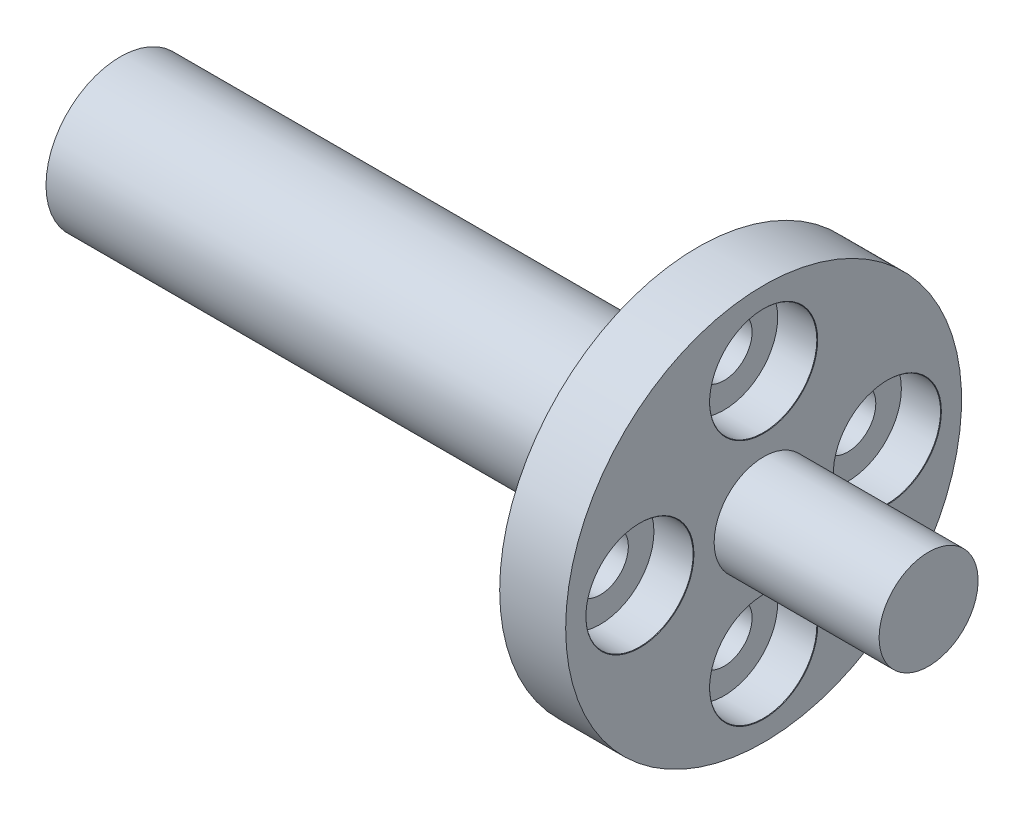
ISO-10303-21;
HEADER;
FILE_DESCRIPTION(('STEP AP214'),'2;1');
FILE_NAME('part.step','',(''),(''),'','','');
FILE_SCHEMA(('AUTOMOTIVE_DESIGN { 1 0 10303 214 1 1 1 1 }'));
ENDSEC;
DATA;
#1=APPLICATION_CONTEXT('core data for automotive mechanical design processes');
#2=APPLICATION_PROTOCOL_DEFINITION('international standard','automotive_design',2000,#1);
#3=PRODUCT_CONTEXT('',#1,'mechanical');
#4=PRODUCT('Part','Part','',(#3));
#5=PRODUCT_RELATED_PRODUCT_CATEGORY('part','',(#4));
#6=PRODUCT_DEFINITION_FORMATION('','',#4);
#7=PRODUCT_DEFINITION_CONTEXT('part definition',#1,'design');
#8=PRODUCT_DEFINITION('design','',#6,#7);
#9=PRODUCT_DEFINITION_SHAPE('','',#8);
#10=(LENGTH_UNIT() NAMED_UNIT(*) SI_UNIT(.MILLI.,.METRE.));
#11=(NAMED_UNIT(*) PLANE_ANGLE_UNIT() SI_UNIT($,.RADIAN.));
#12=(NAMED_UNIT(*) SI_UNIT($,.STERADIAN.) SOLID_ANGLE_UNIT());
#13=UNCERTAINTY_MEASURE_WITH_UNIT(LENGTH_MEASURE(1.E-05),#10,'distance_accuracy_value','');
#14=(GEOMETRIC_REPRESENTATION_CONTEXT(3) GLOBAL_UNCERTAINTY_ASSIGNED_CONTEXT((#13)) GLOBAL_UNIT_ASSIGNED_CONTEXT((#10,
#11,#12)) REPRESENTATION_CONTEXT('',''));
#15=CARTESIAN_POINT('',(0.,0.,0.));
#16=DIRECTION('',(0.,0.,1.));
#17=DIRECTION('',(1.,0.,0.));
#18=AXIS2_PLACEMENT_3D('',#15,#16,#17);
#19=CARTESIAN_POINT('',(49.,0.,0.));
#20=DIRECTION('',(-1.,0.,0.));
#21=DIRECTION('',(0.,0.,1.));
#22=AXIS2_PLACEMENT_3D('',#19,#20,#21);
#23=PLANE('',#22);
#24=CARTESIAN_POINT('',(49.,0.,0.));
#25=DIRECTION('',(-1.,0.,0.));
#26=DIRECTION('',(0.,0.,1.));
#27=AXIS2_PLACEMENT_3D('',#24,#25,#26);
#28=CIRCLE('',#27,3.);
#29=CARTESIAN_POINT('',(49.,0.,3.));
#30=VERTEX_POINT('',#29);
#31=EDGE_CURVE('E10',#30,#30,#28,.T.);
#32=ORIENTED_EDGE('',*,*,#31,.F.);
#33=EDGE_LOOP('',(#32));
#34=FACE_BOUND('',#33,.T.);
#35=ADVANCED_FACE('F43',(#34),#23,.F.);
#36=CARTESIAN_POINT('',(0.,0.,0.));
#37=DIRECTION('',(-1.,0.,0.));
#38=DIRECTION('',(0.,0.,1.));
#39=AXIS2_PLACEMENT_3D('',#36,#37,#38);
#40=CYLINDRICAL_SURFACE('',#39,3.);
#41=CARTESIAN_POINT('',(39.,0.,0.));
#42=DIRECTION('',(-1.,0.,0.));
#43=DIRECTION('',(0.,0.,1.));
#44=AXIS2_PLACEMENT_3D('',#41,#42,#43);
#45=CIRCLE('',#44,3.);
#46=CARTESIAN_POINT('',(39.,0.,3.));
#47=VERTEX_POINT('',#46);
#48=EDGE_CURVE('E51',#47,#47,#45,.T.);
#49=ORIENTED_EDGE('',*,*,#48,.F.);
#50=EDGE_LOOP('',(#49));
#51=FACE_BOUND('',#50,.T.);
#52=ORIENTED_EDGE('',*,*,#31,.T.);
#53=EDGE_LOOP('',(#52));
#54=FACE_BOUND('',#53,.T.);
#55=ADVANCED_FACE('F138',(#51,#54),#40,.T.);
#56=CARTESIAN_POINT('',(39.,3.,0.));
#57=DIRECTION('',(-1.,0.,0.));
#58=DIRECTION('',(0.,0.,1.));
#59=AXIS2_PLACEMENT_3D('',#56,#57,#58);
#60=PLANE('',#59);
#61=CARTESIAN_POINT('',(39.,7.5,0.));
#62=DIRECTION('',(1.,0.,0.));
#63=DIRECTION('',(0.,0.,-1.));
#64=AXIS2_PLACEMENT_3D('',#61,#62,#63);
#65=CIRCLE('',#64,3.275);
#66=CARTESIAN_POINT('',(39.,7.5,-3.275));
#67=VERTEX_POINT('',#66);
#68=EDGE_CURVE('E234',#67,#67,#65,.T.);
#69=ORIENTED_EDGE('',*,*,#68,.F.);
#70=EDGE_LOOP('',(#69));
#71=FACE_BOUND('',#70,.T.);
#72=CARTESIAN_POINT('',(39.,2.11785093078989E-13,-7.50000000000021));
#73=DIRECTION('',(1.,0.,0.));
#74=DIRECTION('',(0.,0.,-1.));
#75=AXIS2_PLACEMENT_3D('',#72,#73,#74);
#76=CIRCLE('',#75,3.275);
#77=CARTESIAN_POINT('',(39.,2.11785093078989E-13,-10.7750000000002));
#78=VERTEX_POINT('',#77);
#79=EDGE_CURVE('E248',#78,#78,#76,.T.);
#80=ORIENTED_EDGE('',*,*,#79,.F.);
#81=EDGE_LOOP('',(#80));
#82=FACE_BOUND('',#81,.T.);
#83=CARTESIAN_POINT('',(39.,-7.5,-4.23570186157979E-13));
#84=DIRECTION('',(1.,0.,0.));
#85=DIRECTION('',(0.,0.,-1.));
#86=AXIS2_PLACEMENT_3D('',#83,#84,#85);
#87=CIRCLE('',#86,3.275);
#88=CARTESIAN_POINT('',(39.,-7.5,-3.27500000000042));
#89=VERTEX_POINT('',#88);
#90=EDGE_CURVE('E75',#89,#89,#87,.T.);
#91=ORIENTED_EDGE('',*,*,#90,.F.);
#92=EDGE_LOOP('',(#91));
#93=FACE_BOUND('',#92,.T.);
#94=CARTESIAN_POINT('',(39.,-2.10866607979629E-13,7.49999999999979));
#95=DIRECTION('',(1.,0.,0.));
#96=DIRECTION('',(0.,0.,-1.));
#97=AXIS2_PLACEMENT_3D('',#94,#95,#96);
#98=CIRCLE('',#97,3.275);
#99=CARTESIAN_POINT('',(39.,-2.10866607979629E-13,4.22499999999979));
#100=VERTEX_POINT('',#99);
#101=EDGE_CURVE('E70',#100,#100,#98,.T.);
#102=ORIENTED_EDGE('',*,*,#101,.F.);
#103=EDGE_LOOP('',(#102));
#104=FACE_BOUND('',#103,.T.);
#105=CARTESIAN_POINT('',(39.,0.,0.));
#106=DIRECTION('',(-1.,0.,0.));
#107=DIRECTION('',(0.,0.,1.));
#108=AXIS2_PLACEMENT_3D('',#105,#106,#107);
#109=CIRCLE('',#108,12.);
#110=CARTESIAN_POINT('',(39.,0.,12.));
#111=VERTEX_POINT('',#110);
#112=EDGE_CURVE('E57',#111,#111,#109,.T.);
#113=ORIENTED_EDGE('',*,*,#112,.F.);
#114=EDGE_LOOP('',(#113));
#115=FACE_BOUND('',#114,.T.);
#116=ORIENTED_EDGE('',*,*,#48,.T.);
#117=EDGE_LOOP('',(#116));
#118=FACE_BOUND('',#117,.T.);
#119=ADVANCED_FACE('F135',(#71,#82,#93,#104,#115,#118),#60,.F.);
#120=CARTESIAN_POINT('',(0.,0.,0.));
#121=DIRECTION('',(-1.,0.,0.));
#122=DIRECTION('',(0.,0.,1.));
#123=AXIS2_PLACEMENT_3D('',#120,#121,#122);
#124=CYLINDRICAL_SURFACE('',#123,12.);
#125=CARTESIAN_POINT('',(35.,0.,0.));
#126=DIRECTION('',(-1.,0.,0.));
#127=DIRECTION('',(0.,0.,1.));
#128=AXIS2_PLACEMENT_3D('',#125,#126,#127);
#129=CIRCLE('',#128,12.);
#130=CARTESIAN_POINT('',(35.,0.,12.));
#131=VERTEX_POINT('',#130);
#132=EDGE_CURVE('E126',#131,#131,#129,.T.);
#133=ORIENTED_EDGE('',*,*,#132,.F.);
#134=EDGE_LOOP('',(#133));
#135=FACE_BOUND('',#134,.T.);
#136=ORIENTED_EDGE('',*,*,#112,.T.);
#137=EDGE_LOOP('',(#136));
#138=FACE_BOUND('',#137,.T.);
#139=ADVANCED_FACE('F133',(#135,#138),#124,.T.);
#140=CARTESIAN_POINT('',(35.,12.,0.));
#141=DIRECTION('',(1.,0.,0.));
#142=DIRECTION('',(0.,0.,-1.));
#143=AXIS2_PLACEMENT_3D('',#140,#141,#142);
#144=PLANE('',#143);
#145=CARTESIAN_POINT('',(35.,7.5,0.));
#146=DIRECTION('',(1.,0.,0.));
#147=DIRECTION('',(0.,0.,-1.));
#148=AXIS2_PLACEMENT_3D('',#145,#146,#147);
#149=CIRCLE('',#148,1.7);
#150=CARTESIAN_POINT('',(35.,7.5,-1.7));
#151=VERTEX_POINT('',#150);
#152=EDGE_CURVE('E46',#151,#151,#149,.T.);
#153=ORIENTED_EDGE('',*,*,#152,.T.);
#154=EDGE_LOOP('',(#153));
#155=FACE_BOUND('',#154,.T.);
#156=CARTESIAN_POINT('',(35.,2.11785093078989E-13,-7.50000000000021));
#157=DIRECTION('',(1.,0.,0.));
#158=DIRECTION('',(0.,0.,-1.));
#159=AXIS2_PLACEMENT_3D('',#156,#157,#158);
#160=CIRCLE('',#159,1.7);
#161=CARTESIAN_POINT('',(35.,2.11785093078989E-13,-9.20000000000021));
#162=VERTEX_POINT('',#161);
#163=EDGE_CURVE('E72',#162,#162,#160,.T.);
#164=ORIENTED_EDGE('',*,*,#163,.T.);
#165=EDGE_LOOP('',(#164));
#166=FACE_BOUND('',#165,.T.);
#167=CARTESIAN_POINT('',(35.,-7.5,-4.23570186157979E-13));
#168=DIRECTION('',(1.,0.,0.));
#169=DIRECTION('',(0.,0.,-1.));
#170=AXIS2_PLACEMENT_3D('',#167,#168,#169);
#171=CIRCLE('',#170,1.7);
#172=CARTESIAN_POINT('',(35.,-7.5,-1.70000000000042));
#173=VERTEX_POINT('',#172);
#174=EDGE_CURVE('E67',#173,#173,#171,.T.);
#175=ORIENTED_EDGE('',*,*,#174,.T.);
#176=EDGE_LOOP('',(#175));
#177=FACE_BOUND('',#176,.T.);
#178=CARTESIAN_POINT('',(35.,-2.10866607979629E-13,7.49999999999979));
#179=DIRECTION('',(1.,0.,0.));
#180=DIRECTION('',(0.,0.,-1.));
#181=AXIS2_PLACEMENT_3D('',#178,#179,#180);
#182=CIRCLE('',#181,1.7);
#183=CARTESIAN_POINT('',(35.,-2.10866607979629E-13,5.79999999999979));
#184=VERTEX_POINT('',#183);
#185=EDGE_CURVE('E61',#184,#184,#182,.T.);
#186=ORIENTED_EDGE('',*,*,#185,.T.);
#187=EDGE_LOOP('',(#186));
#188=FACE_BOUND('',#187,.T.);
#189=CARTESIAN_POINT('',(35.,0.,0.));
#190=DIRECTION('',(-1.,0.,0.));
#191=DIRECTION('',(0.,0.,1.));
#192=AXIS2_PLACEMENT_3D('',#189,#190,#191);
#193=CIRCLE('',#192,4.5);
#194=CARTESIAN_POINT('',(35.,0.,4.5));
#195=VERTEX_POINT('',#194);
#196=EDGE_CURVE('E122',#195,#195,#193,.T.);
#197=ORIENTED_EDGE('',*,*,#196,.F.);
#198=EDGE_LOOP('',(#197));
#199=FACE_BOUND('',#198,.T.);
#200=ORIENTED_EDGE('',*,*,#132,.T.);
#201=EDGE_LOOP('',(#200));
#202=FACE_BOUND('',#201,.T.);
#203=ADVANCED_FACE('F151',(#155,#166,#177,#188,#199,#202),#144,.F.);
#204=CARTESIAN_POINT('',(0.,0.,0.));
#205=DIRECTION('',(-1.,0.,0.));
#206=DIRECTION('',(0.,0.,1.));
#207=AXIS2_PLACEMENT_3D('',#204,#205,#206);
#208=CYLINDRICAL_SURFACE('',#207,4.5);
#209=CARTESIAN_POINT('',(0.,0.,0.));
#210=DIRECTION('',(-1.,0.,0.));
#211=DIRECTION('',(0.,0.,1.));
#212=AXIS2_PLACEMENT_3D('',#209,#210,#211);
#213=CIRCLE('',#212,4.5);
#214=CARTESIAN_POINT('',(0.,0.,4.5));
#215=VERTEX_POINT('',#214);
#216=EDGE_CURVE('E65',#215,#215,#213,.T.);
#217=ORIENTED_EDGE('',*,*,#216,.F.);
#218=EDGE_LOOP('',(#217));
#219=FACE_BOUND('',#218,.T.);
#220=ORIENTED_EDGE('',*,*,#196,.T.);
#221=EDGE_LOOP('',(#220));
#222=FACE_BOUND('',#221,.T.);
#223=ADVANCED_FACE('F155',(#219,#222),#208,.T.);
#224=CARTESIAN_POINT('',(0.,4.5,0.));
#225=DIRECTION('',(1.,0.,0.));
#226=DIRECTION('',(0.,0.,-1.));
#227=AXIS2_PLACEMENT_3D('',#224,#225,#226);
#228=PLANE('',#227);
#229=ORIENTED_EDGE('',*,*,#216,.T.);
#230=EDGE_LOOP('',(#229));
#231=FACE_BOUND('',#230,.T.);
#232=ADVANCED_FACE('F159',(#231),#228,.F.);
#233=CARTESIAN_POINT('',(39.,-2.10866607979629E-13,7.49999999999979));
#234=DIRECTION('',(1.,0.,0.));
#235=DIRECTION('',(0.,0.,-1.));
#236=AXIS2_PLACEMENT_3D('',#233,#234,#235);
#237=CYLINDRICAL_SURFACE('',#236,1.7);
#238=CARTESIAN_POINT('',(36.6,-2.10866607979629E-13,7.49999999999979));
#239=DIRECTION('',(1.,0.,0.));
#240=DIRECTION('',(0.,0.,-1.));
#241=AXIS2_PLACEMENT_3D('',#238,#239,#240);
#242=CIRCLE('',#241,1.7);
#243=CARTESIAN_POINT('',(36.6,-2.10866607979629E-13,5.79999999999978));
#244=VERTEX_POINT('',#243);
#245=EDGE_CURVE('E66',#244,#244,#242,.T.);
#246=ORIENTED_EDGE('',*,*,#245,.T.);
#247=EDGE_LOOP('',(#246));
#248=FACE_BOUND('',#247,.T.);
#249=ORIENTED_EDGE('',*,*,#185,.F.);
#250=EDGE_LOOP('',(#249));
#251=FACE_BOUND('',#250,.T.);
#252=ADVANCED_FACE('F163',(#248,#251),#237,.F.);
#253=CARTESIAN_POINT('',(36.6,3.24999999999979,7.49999999999979));
#254=DIRECTION('',(-1.,0.,0.));
#255=DIRECTION('',(0.,0.,1.));
#256=AXIS2_PLACEMENT_3D('',#253,#254,#255);
#257=PLANE('',#256);
#258=ORIENTED_EDGE('',*,*,#245,.F.);
#259=EDGE_LOOP('',(#258));
#260=FACE_BOUND('',#259,.T.);
#261=CARTESIAN_POINT('',(36.6,-2.10866607979629E-13,7.49999999999979));
#262=DIRECTION('',(1.,0.,0.));
#263=DIRECTION('',(0.,0.,-1.));
#264=AXIS2_PLACEMENT_3D('',#261,#262,#263);
#265=CIRCLE('',#264,3.25);
#266=CARTESIAN_POINT('',(36.6,-2.10866607979629E-13,4.24999999999979));
#267=VERTEX_POINT('',#266);
#268=EDGE_CURVE('E112',#267,#267,#265,.T.);
#269=ORIENTED_EDGE('',*,*,#268,.T.);
#270=EDGE_LOOP('',(#269));
#271=FACE_BOUND('',#270,.T.);
#272=ADVANCED_FACE('F167',(#260,#271),#257,.F.);
#273=CARTESIAN_POINT('',(39.,-2.10866607979629E-13,7.49999999999979));
#274=DIRECTION('',(1.,0.,0.));
#275=DIRECTION('',(0.,0.,-1.));
#276=AXIS2_PLACEMENT_3D('',#273,#274,#275);
#277=CYLINDRICAL_SURFACE('',#276,3.25);
#278=ORIENTED_EDGE('',*,*,#268,.F.);
#279=EDGE_LOOP('',(#278));
#280=FACE_BOUND('',#279,.T.);
#281=CARTESIAN_POINT('',(38.975,-2.10866607979629E-13,7.49999999999979));
#282=DIRECTION('',(1.,0.,0.));
#283=DIRECTION('',(0.,0.,-1.));
#284=AXIS2_PLACEMENT_3D('',#281,#282,#283);
#285=CIRCLE('',#284,3.25);
#286=CARTESIAN_POINT('',(38.975,-2.10866607979629E-13,4.24999999999979));
#287=VERTEX_POINT('',#286);
#288=EDGE_CURVE('E108',#287,#287,#285,.T.);
#289=ORIENTED_EDGE('',*,*,#288,.T.);
#290=EDGE_LOOP('',(#289));
#291=FACE_BOUND('',#290,.T.);
#292=ADVANCED_FACE('F171',(#280,#291),#277,.F.);
#293=CARTESIAN_POINT('',(39.,-2.10866607979629E-13,7.49999999999979));
#294=DIRECTION('',(1.,0.,0.));
#295=DIRECTION('',(0.,0.,-1.));
#296=AXIS2_PLACEMENT_3D('',#293,#294,#295);
#297=CONICAL_SURFACE('',#296,3.275,0.785398163397518);
#298=ORIENTED_EDGE('',*,*,#288,.F.);
#299=EDGE_LOOP('',(#298));
#300=FACE_BOUND('',#299,.T.);
#301=ORIENTED_EDGE('',*,*,#101,.T.);
#302=EDGE_LOOP('',(#301));
#303=FACE_BOUND('',#302,.T.);
#304=ADVANCED_FACE('F175',(#300,#303),#297,.F.);
#305=CARTESIAN_POINT('',(39.,-7.5,-4.23570186157979E-13));
#306=DIRECTION('',(1.,0.,0.));
#307=DIRECTION('',(0.,0.,-1.));
#308=AXIS2_PLACEMENT_3D('',#305,#306,#307);
#309=CYLINDRICAL_SURFACE('',#308,1.7);
#310=CARTESIAN_POINT('',(36.6,-7.5,-4.23570186157979E-13));
#311=DIRECTION('',(1.,0.,0.));
#312=DIRECTION('',(0.,0.,-1.));
#313=AXIS2_PLACEMENT_3D('',#310,#311,#312);
#314=CIRCLE('',#313,1.7);
#315=CARTESIAN_POINT('',(36.6,-7.5,-1.70000000000043));
#316=VERTEX_POINT('',#315);
#317=EDGE_CURVE('E71',#316,#316,#314,.T.);
#318=ORIENTED_EDGE('',*,*,#317,.T.);
#319=EDGE_LOOP('',(#318));
#320=FACE_BOUND('',#319,.T.);
#321=ORIENTED_EDGE('',*,*,#174,.F.);
#322=EDGE_LOOP('',(#321));
#323=FACE_BOUND('',#322,.T.);
#324=ADVANCED_FACE('F179',(#320,#323),#309,.F.);
#325=CARTESIAN_POINT('',(36.6,-4.25,-4.23570186157979E-13));
#326=DIRECTION('',(-1.,0.,0.));
#327=DIRECTION('',(0.,0.,1.));
#328=AXIS2_PLACEMENT_3D('',#325,#326,#327);
#329=PLANE('',#328);
#330=ORIENTED_EDGE('',*,*,#317,.F.);
#331=EDGE_LOOP('',(#330));
#332=FACE_BOUND('',#331,.T.);
#333=CARTESIAN_POINT('',(36.6,-7.5,-4.23570186157979E-13));
#334=DIRECTION('',(1.,0.,0.));
#335=DIRECTION('',(0.,0.,-1.));
#336=AXIS2_PLACEMENT_3D('',#333,#334,#335);
#337=CIRCLE('',#336,3.25);
#338=CARTESIAN_POINT('',(36.6,-7.5,-3.25000000000042));
#339=VERTEX_POINT('',#338);
#340=EDGE_CURVE('E98',#339,#339,#337,.T.);
#341=ORIENTED_EDGE('',*,*,#340,.T.);
#342=EDGE_LOOP('',(#341));
#343=FACE_BOUND('',#342,.T.);
#344=ADVANCED_FACE('F183',(#332,#343),#329,.F.);
#345=CARTESIAN_POINT('',(39.,-7.5,-4.23570186157979E-13));
#346=DIRECTION('',(1.,0.,0.));
#347=DIRECTION('',(0.,0.,-1.));
#348=AXIS2_PLACEMENT_3D('',#345,#346,#347);
#349=CYLINDRICAL_SURFACE('',#348,3.25);
#350=ORIENTED_EDGE('',*,*,#340,.F.);
#351=EDGE_LOOP('',(#350));
#352=FACE_BOUND('',#351,.T.);
#353=CARTESIAN_POINT('',(38.975,-7.5,-4.23570186157979E-13));
#354=DIRECTION('',(1.,0.,0.));
#355=DIRECTION('',(0.,0.,-1.));
#356=AXIS2_PLACEMENT_3D('',#353,#354,#355);
#357=CIRCLE('',#356,3.25);
#358=CARTESIAN_POINT('',(38.975,-7.5,-3.25000000000042));
#359=VERTEX_POINT('',#358);
#360=EDGE_CURVE('E82',#359,#359,#357,.T.);
#361=ORIENTED_EDGE('',*,*,#360,.T.);
#362=EDGE_LOOP('',(#361));
#363=FACE_BOUND('',#362,.T.);
#364=ADVANCED_FACE('F187',(#352,#363),#349,.F.);
#365=CARTESIAN_POINT('',(39.,-7.5,-4.23570186157979E-13));
#366=DIRECTION('',(1.,0.,0.));
#367=DIRECTION('',(0.,0.,-1.));
#368=AXIS2_PLACEMENT_3D('',#365,#366,#367);
#369=CONICAL_SURFACE('',#368,3.275,0.785398163397518);
#370=ORIENTED_EDGE('',*,*,#360,.F.);
#371=EDGE_LOOP('',(#370));
#372=FACE_BOUND('',#371,.T.);
#373=ORIENTED_EDGE('',*,*,#90,.T.);
#374=EDGE_LOOP('',(#373));
#375=FACE_BOUND('',#374,.T.);
#376=ADVANCED_FACE('F191',(#372,#375),#369,.F.);
#377=CARTESIAN_POINT('',(39.,2.11785093078989E-13,-7.50000000000021));
#378=DIRECTION('',(1.,0.,0.));
#379=DIRECTION('',(0.,0.,-1.));
#380=AXIS2_PLACEMENT_3D('',#377,#378,#379);
#381=CYLINDRICAL_SURFACE('',#380,1.7);
#382=CARTESIAN_POINT('',(36.6,2.11785093078989E-13,-7.50000000000021));
#383=DIRECTION('',(1.,0.,0.));
#384=DIRECTION('',(0.,0.,-1.));
#385=AXIS2_PLACEMENT_3D('',#382,#383,#384);
#386=CIRCLE('',#385,1.7);
#387=CARTESIAN_POINT('',(36.6,2.11785093078989E-13,-9.20000000000021));
#388=VERTEX_POINT('',#387);
#389=EDGE_CURVE('E76',#388,#388,#386,.T.);
#390=ORIENTED_EDGE('',*,*,#389,.T.);
#391=EDGE_LOOP('',(#390));
#392=FACE_BOUND('',#391,.T.);
#393=ORIENTED_EDGE('',*,*,#163,.F.);
#394=EDGE_LOOP('',(#393));
#395=FACE_BOUND('',#394,.T.);
#396=ADVANCED_FACE('F195',(#392,#395),#381,.F.);
#397=CARTESIAN_POINT('',(36.6,3.25000000000021,-7.50000000000021));
#398=DIRECTION('',(-1.,0.,0.));
#399=DIRECTION('',(0.,0.,1.));
#400=AXIS2_PLACEMENT_3D('',#397,#398,#399);
#401=PLANE('',#400);
#402=ORIENTED_EDGE('',*,*,#389,.F.);
#403=EDGE_LOOP('',(#402));
#404=FACE_BOUND('',#403,.T.);
#405=CARTESIAN_POINT('',(36.6,2.11785093078989E-13,-7.50000000000021));
#406=DIRECTION('',(1.,0.,0.));
#407=DIRECTION('',(0.,0.,-1.));
#408=AXIS2_PLACEMENT_3D('',#405,#406,#407);
#409=CIRCLE('',#408,3.25);
#410=CARTESIAN_POINT('',(36.6,2.11785093078989E-13,-10.7500000000002));
#411=VERTEX_POINT('',#410);
#412=EDGE_CURVE('E85',#411,#411,#409,.T.);
#413=ORIENTED_EDGE('',*,*,#412,.T.);
#414=EDGE_LOOP('',(#413));
#415=FACE_BOUND('',#414,.T.);
#416=ADVANCED_FACE('F199',(#404,#415),#401,.F.);
#417=CARTESIAN_POINT('',(39.,2.11785093078989E-13,-7.50000000000021));
#418=DIRECTION('',(1.,0.,0.));
#419=DIRECTION('',(0.,0.,-1.));
#420=AXIS2_PLACEMENT_3D('',#417,#418,#419);
#421=CYLINDRICAL_SURFACE('',#420,3.25);
#422=ORIENTED_EDGE('',*,*,#412,.F.);
#423=EDGE_LOOP('',(#422));
#424=FACE_BOUND('',#423,.T.);
#425=CARTESIAN_POINT('',(38.975,2.11785093078989E-13,-7.50000000000021));
#426=DIRECTION('',(1.,0.,0.));
#427=DIRECTION('',(0.,0.,-1.));
#428=AXIS2_PLACEMENT_3D('',#425,#426,#427);
#429=CIRCLE('',#428,3.25);
#430=CARTESIAN_POINT('',(38.975,2.11785093078989E-13,-10.7500000000002));
#431=VERTEX_POINT('',#430);
#432=EDGE_CURVE('E91',#431,#431,#429,.T.);
#433=ORIENTED_EDGE('',*,*,#432,.T.);
#434=EDGE_LOOP('',(#433));
#435=FACE_BOUND('',#434,.T.);
#436=ADVANCED_FACE('F202',(#424,#435),#421,.F.);
#437=CARTESIAN_POINT('',(39.,2.11785093078989E-13,-7.50000000000021));
#438=DIRECTION('',(1.,0.,0.));
#439=DIRECTION('',(0.,0.,-1.));
#440=AXIS2_PLACEMENT_3D('',#437,#438,#439);
#441=CONICAL_SURFACE('',#440,3.275,0.785398163397518);
#442=ORIENTED_EDGE('',*,*,#432,.F.);
#443=EDGE_LOOP('',(#442));
#444=FACE_BOUND('',#443,.T.);
#445=ORIENTED_EDGE('',*,*,#79,.T.);
#446=EDGE_LOOP('',(#445));
#447=FACE_BOUND('',#446,.T.);
#448=ADVANCED_FACE('F206',(#444,#447),#441,.F.);
#449=CARTESIAN_POINT('',(39.,7.5,0.));
#450=DIRECTION('',(1.,0.,0.));
#451=DIRECTION('',(0.,0.,-1.));
#452=AXIS2_PLACEMENT_3D('',#449,#450,#451);
#453=CYLINDRICAL_SURFACE('',#452,1.7);
#454=CARTESIAN_POINT('',(36.6,7.5,0.));
#455=DIRECTION('',(1.,0.,0.));
#456=DIRECTION('',(0.,0.,-1.));
#457=AXIS2_PLACEMENT_3D('',#454,#455,#456);
#458=CIRCLE('',#457,1.7);
#459=CARTESIAN_POINT('',(36.6,7.5,-1.7));
#460=VERTEX_POINT('',#459);
#461=EDGE_CURVE('E244',#460,#460,#458,.T.);
#462=ORIENTED_EDGE('',*,*,#461,.T.);
#463=EDGE_LOOP('',(#462));
#464=FACE_BOUND('',#463,.T.);
#465=ORIENTED_EDGE('',*,*,#152,.F.);
#466=EDGE_LOOP('',(#465));
#467=FACE_BOUND('',#466,.T.);
#468=ADVANCED_FACE('F210',(#464,#467),#453,.F.);
#469=CARTESIAN_POINT('',(36.6,10.75,0.));
#470=DIRECTION('',(-1.,0.,0.));
#471=DIRECTION('',(0.,0.,1.));
#472=AXIS2_PLACEMENT_3D('',#469,#470,#471);
#473=PLANE('',#472);
#474=ORIENTED_EDGE('',*,*,#461,.F.);
#475=EDGE_LOOP('',(#474));
#476=FACE_BOUND('',#475,.T.);
#477=CARTESIAN_POINT('',(36.6,7.5,0.));
#478=DIRECTION('',(1.,0.,0.));
#479=DIRECTION('',(0.,0.,-1.));
#480=AXIS2_PLACEMENT_3D('',#477,#478,#479);
#481=CIRCLE('',#480,3.25);
#482=CARTESIAN_POINT('',(36.6,7.5,-3.25));
#483=VERTEX_POINT('',#482);
#484=EDGE_CURVE('E238',#483,#483,#481,.T.);
#485=ORIENTED_EDGE('',*,*,#484,.T.);
#486=EDGE_LOOP('',(#485));
#487=FACE_BOUND('',#486,.T.);
#488=ADVANCED_FACE('F214',(#476,#487),#473,.F.);
#489=CARTESIAN_POINT('',(39.,7.5,0.));
#490=DIRECTION('',(1.,0.,0.));
#491=DIRECTION('',(0.,0.,-1.));
#492=AXIS2_PLACEMENT_3D('',#489,#490,#491);
#493=CYLINDRICAL_SURFACE('',#492,3.25);
#494=ORIENTED_EDGE('',*,*,#484,.F.);
#495=EDGE_LOOP('',(#494));
#496=FACE_BOUND('',#495,.T.);
#497=CARTESIAN_POINT('',(38.975,7.5,0.));
#498=DIRECTION('',(1.,0.,0.));
#499=DIRECTION('',(0.,0.,-1.));
#500=AXIS2_PLACEMENT_3D('',#497,#498,#499);
#501=CIRCLE('',#500,3.25);
#502=CARTESIAN_POINT('',(38.975,7.5,-3.25));
#503=VERTEX_POINT('',#502);
#504=EDGE_CURVE('E231',#503,#503,#501,.T.);
#505=ORIENTED_EDGE('',*,*,#504,.T.);
#506=EDGE_LOOP('',(#505));
#507=FACE_BOUND('',#506,.T.);
#508=ADVANCED_FACE('F218',(#496,#507),#493,.F.);
#509=CARTESIAN_POINT('',(39.,7.5,0.));
#510=DIRECTION('',(1.,0.,0.));
#511=DIRECTION('',(0.,0.,-1.));
#512=AXIS2_PLACEMENT_3D('',#509,#510,#511);
#513=CONICAL_SURFACE('',#512,3.275,0.785398163397518);
#514=ORIENTED_EDGE('',*,*,#504,.F.);
#515=EDGE_LOOP('',(#514));
#516=FACE_BOUND('',#515,.T.);
#517=ORIENTED_EDGE('',*,*,#68,.T.);
#518=EDGE_LOOP('',(#517));
#519=FACE_BOUND('',#518,.T.);
#520=ADVANCED_FACE('F222',(#516,#519),#513,.F.);
#521=CLOSED_SHELL('',(#35,#55,#119,#139,#203,#223,#232,#252,#272,#292,#304,#324,#344,#364,#376,
#396,#416,#436,#448,#468,#488,#508,#520));
#522=MANIFOLD_SOLID_BREP('B2',#521);
#523=ADVANCED_BREP_SHAPE_REPRESENTATION('',(#18,#522),#14);
#524=SHAPE_DEFINITION_REPRESENTATION(#9,#523);
ENDSEC;
END-ISO-10303-21;
